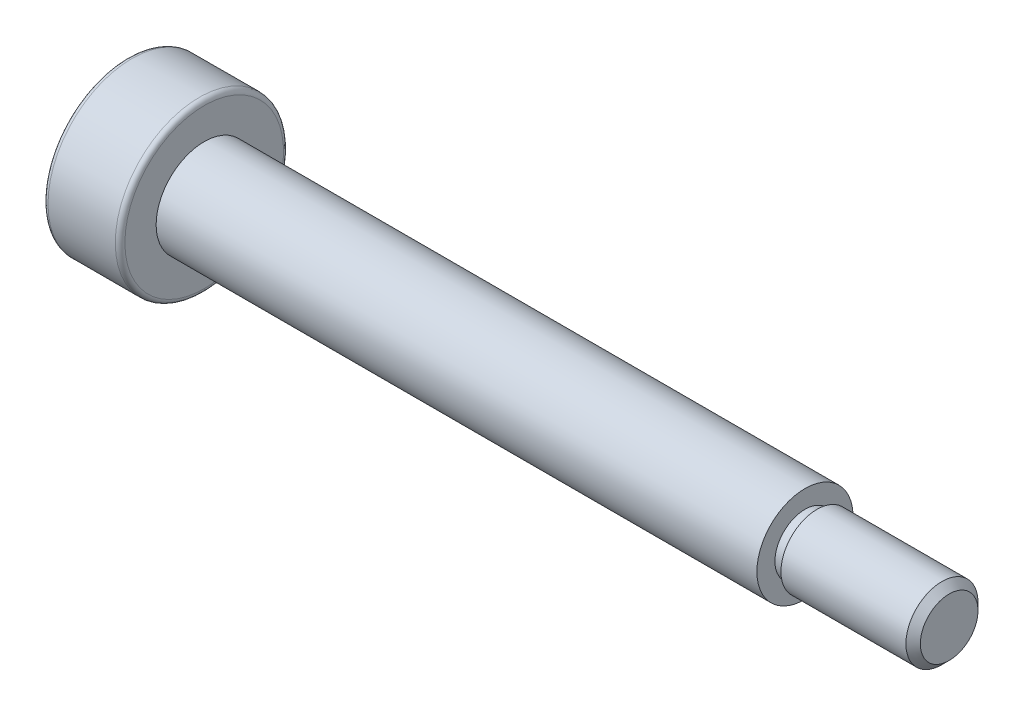
ISO-10303-21;
HEADER;
FILE_DESCRIPTION(('STEP AP214'),'2;1');
FILE_NAME('part.step','',(''),(''),'','','');
FILE_SCHEMA(('AUTOMOTIVE_DESIGN { 1 0 10303 214 1 1 1 1 }'));
ENDSEC;
DATA;
#1=APPLICATION_CONTEXT('core data for automotive mechanical design processes');
#2=APPLICATION_PROTOCOL_DEFINITION('international standard','automotive_design',2000,#1);
#3=PRODUCT_CONTEXT('',#1,'mechanical');
#4=PRODUCT('Part','Part','',(#3));
#5=PRODUCT_RELATED_PRODUCT_CATEGORY('part','',(#4));
#6=PRODUCT_DEFINITION_FORMATION('','',#4);
#7=PRODUCT_DEFINITION_CONTEXT('part definition',#1,'design');
#8=PRODUCT_DEFINITION('design','',#6,#7);
#9=PRODUCT_DEFINITION_SHAPE('','',#8);
#10=(LENGTH_UNIT() NAMED_UNIT(*) SI_UNIT(.MILLI.,.METRE.));
#11=(NAMED_UNIT(*) PLANE_ANGLE_UNIT() SI_UNIT($,.RADIAN.));
#12=(NAMED_UNIT(*) SI_UNIT($,.STERADIAN.) SOLID_ANGLE_UNIT());
#13=UNCERTAINTY_MEASURE_WITH_UNIT(LENGTH_MEASURE(1.E-05),#10,'distance_accuracy_value','');
#14=(GEOMETRIC_REPRESENTATION_CONTEXT(3) GLOBAL_UNCERTAINTY_ASSIGNED_CONTEXT((#13)) GLOBAL_UNIT_ASSIGNED_CONTEXT((#10,
#11,#12)) REPRESENTATION_CONTEXT('',''));
#15=CARTESIAN_POINT('',(0.,0.,0.));
#16=DIRECTION('',(0.,0.,1.));
#17=DIRECTION('',(1.,0.,0.));
#18=AXIS2_PLACEMENT_3D('',#15,#16,#17);
#19=CARTESIAN_POINT('',(-17.1,0.,0.));
#20=DIRECTION('',(1.,0.,0.));
#21=DIRECTION('',(0.,0.,-1.));
#22=AXIS2_PLACEMENT_3D('',#19,#20,#21);
#23=PLANE('',#22);
#24=DIRECTION('',(0.,0.866025403784438,-0.5));
#25=VECTOR('',#24,1.);
#26=CARTESIAN_POINT('',(-17.1,0.,1.73205080756888));
#27=LINE('',#26,#25);
#28=CARTESIAN_POINT('',(-17.1,0.,1.73205080756888));
#29=VERTEX_POINT('',#28);
#30=CARTESIAN_POINT('',(-17.1,1.5,0.866025403784438));
#31=VERTEX_POINT('',#30);
#32=EDGE_CURVE('E127',#29,#31,#27,.T.);
#33=ORIENTED_EDGE('',*,*,#32,.F.);
#34=DIRECTION('',(0.,0.866025403784439,0.5));
#35=VECTOR('',#34,1.);
#36=CARTESIAN_POINT('',(-17.1,-1.5,0.866025403784438));
#37=LINE('',#36,#35);
#38=CARTESIAN_POINT('',(-17.1,-1.5,0.866025403784438));
#39=VERTEX_POINT('',#38);
#40=EDGE_CURVE('E53',#39,#29,#37,.T.);
#41=ORIENTED_EDGE('',*,*,#40,.F.);
#42=DIRECTION('',(0.,0.,1.));
#43=VECTOR('',#42,1.);
#44=CARTESIAN_POINT('',(-17.1,-1.5,-0.866025403784438));
#45=LINE('',#44,#43);
#46=CARTESIAN_POINT('',(-17.1,-1.5,-0.866025403784438));
#47=VERTEX_POINT('',#46);
#48=EDGE_CURVE('E136',#47,#39,#45,.T.);
#49=ORIENTED_EDGE('',*,*,#48,.F.);
#50=DIRECTION('',(0.,-0.866025403784438,0.5));
#51=VECTOR('',#50,1.);
#52=CARTESIAN_POINT('',(-17.1,0.,-1.73205080756888));
#53=LINE('',#52,#51);
#54=CARTESIAN_POINT('',(-17.1,0.,-1.73205080756888));
#55=VERTEX_POINT('',#54);
#56=EDGE_CURVE('E134',#55,#47,#53,.T.);
#57=ORIENTED_EDGE('',*,*,#56,.F.);
#58=DIRECTION('',(0.,-0.866025403784439,-0.5));
#59=VECTOR('',#58,1.);
#60=CARTESIAN_POINT('',(-17.1,1.5,-0.866025403784438));
#61=LINE('',#60,#59);
#62=CARTESIAN_POINT('',(-17.1,1.5,-0.866025403784438));
#63=VERTEX_POINT('',#62);
#64=EDGE_CURVE('E101',#63,#55,#61,.T.);
#65=ORIENTED_EDGE('',*,*,#64,.F.);
#66=DIRECTION('',(0.,0.,-1.));
#67=VECTOR('',#66,1.);
#68=CARTESIAN_POINT('',(-17.1,1.5,0.866025403784438));
#69=LINE('',#68,#67);
#70=EDGE_CURVE('E130',#31,#63,#69,.T.);
#71=ORIENTED_EDGE('',*,*,#70,.F.);
#72=EDGE_LOOP('',(#33,#41,#49,#57,#65,#71));
#73=FACE_BOUND('',#72,.T.);
#74=CARTESIAN_POINT('',(-17.1,0.,0.));
#75=DIRECTION('',(1.,0.,0.));
#76=DIRECTION('',(0.,0.,-1.));
#77=AXIS2_PLACEMENT_3D('',#74,#75,#76);
#78=CIRCLE('',#77,3.3);
#79=CARTESIAN_POINT('',(-17.1,0.,-3.3));
#80=VERTEX_POINT('',#79);
#81=EDGE_CURVE('E169',#80,#80,#78,.F.);
#82=ORIENTED_EDGE('',*,*,#81,.T.);
#83=EDGE_LOOP('',(#82));
#84=FACE_BOUND('',#83,.T.);
#85=ADVANCED_FACE('F37',(#73,#84),#23,.F.);
#86=CARTESIAN_POINT('',(-17.1,0.,0.));
#87=DIRECTION('',(-1.,0.,0.));
#88=DIRECTION('',(0.,0.,1.));
#89=AXIS2_PLACEMENT_3D('',#86,#87,#88);
#90=CYLINDRICAL_SURFACE('',#89,3.5);
#91=CARTESIAN_POINT('',(-14.1,0.,0.));
#92=DIRECTION('',(-1.,0.,0.));
#93=DIRECTION('',(0.,0.,1.));
#94=AXIS2_PLACEMENT_3D('',#91,#92,#93);
#95=CIRCLE('',#94,3.5);
#96=CARTESIAN_POINT('',(-14.1,0.,3.5));
#97=VERTEX_POINT('',#96);
#98=EDGE_CURVE('E163',#97,#97,#95,.T.);
#99=ORIENTED_EDGE('',*,*,#98,.T.);
#100=EDGE_LOOP('',(#99));
#101=FACE_BOUND('',#100,.T.);
#102=CARTESIAN_POINT('',(-16.9,0.,0.));
#103=DIRECTION('',(1.,0.,0.));
#104=DIRECTION('',(0.,0.,-1.));
#105=AXIS2_PLACEMENT_3D('',#102,#103,#104);
#106=CIRCLE('',#105,3.5);
#107=CARTESIAN_POINT('',(-16.9,0.,-3.5));
#108=VERTEX_POINT('',#107);
#109=EDGE_CURVE('E160',#108,#108,#106,.T.);
#110=ORIENTED_EDGE('',*,*,#109,.T.);
#111=EDGE_LOOP('',(#110));
#112=FACE_BOUND('',#111,.T.);
#113=ADVANCED_FACE('F191',(#101,#112),#90,.T.);
#114=CARTESIAN_POINT('',(-13.9,3.5,0.));
#115=DIRECTION('',(-1.,0.,0.));
#116=DIRECTION('',(0.,0.,1.));
#117=AXIS2_PLACEMENT_3D('',#114,#115,#116);
#118=PLANE('',#117);
#119=CARTESIAN_POINT('',(-13.9,0.,0.));
#120=DIRECTION('',(-1.,0.,0.));
#121=DIRECTION('',(0.,0.,1.));
#122=AXIS2_PLACEMENT_3D('',#119,#120,#121);
#123=CIRCLE('',#122,3.3);
#124=CARTESIAN_POINT('',(-13.9,0.,3.3));
#125=VERTEX_POINT('',#124);
#126=EDGE_CURVE('E166',#125,#125,#123,.F.);
#127=ORIENTED_EDGE('',*,*,#126,.T.);
#128=EDGE_LOOP('',(#127));
#129=FACE_BOUND('',#128,.T.);
#130=CARTESIAN_POINT('',(-13.9,0.,0.));
#131=DIRECTION('',(-1.,0.,0.));
#132=DIRECTION('',(0.,0.,1.));
#133=AXIS2_PLACEMENT_3D('',#130,#131,#132);
#134=CIRCLE('',#133,2.);
#135=CARTESIAN_POINT('',(-13.9,0.,2.));
#136=VERTEX_POINT('',#135);
#137=EDGE_CURVE('E157',#136,#136,#134,.T.);
#138=ORIENTED_EDGE('',*,*,#137,.T.);
#139=EDGE_LOOP('',(#138));
#140=FACE_BOUND('',#139,.T.);
#141=ADVANCED_FACE('F197',(#129,#140),#118,.F.);
#142=CARTESIAN_POINT('',(-17.1,0.,0.));
#143=DIRECTION('',(-1.,0.,0.));
#144=DIRECTION('',(0.,0.,1.));
#145=AXIS2_PLACEMENT_3D('',#142,#143,#144);
#146=CYLINDRICAL_SURFACE('',#145,2.);
#147=ORIENTED_EDGE('',*,*,#137,.F.);
#148=EDGE_LOOP('',(#147));
#149=FACE_BOUND('',#148,.T.);
#150=CARTESIAN_POINT('',(11.1,0.,0.));
#151=DIRECTION('',(-1.,0.,0.));
#152=DIRECTION('',(0.,0.,1.));
#153=AXIS2_PLACEMENT_3D('',#150,#151,#152);
#154=CIRCLE('',#153,2.);
#155=CARTESIAN_POINT('',(11.1,0.,2.));
#156=VERTEX_POINT('',#155);
#157=EDGE_CURVE('E154',#156,#156,#154,.T.);
#158=ORIENTED_EDGE('',*,*,#157,.T.);
#159=EDGE_LOOP('',(#158));
#160=FACE_BOUND('',#159,.T.);
#161=ADVANCED_FACE('F231',(#149,#160),#146,.T.);
#162=CARTESIAN_POINT('',(11.1,2.,0.));
#163=DIRECTION('',(-1.,0.,0.));
#164=DIRECTION('',(0.,0.,1.));
#165=AXIS2_PLACEMENT_3D('',#162,#163,#164);
#166=PLANE('',#165);
#167=ORIENTED_EDGE('',*,*,#157,.F.);
#168=EDGE_LOOP('',(#167));
#169=FACE_BOUND('',#168,.T.);
#170=CARTESIAN_POINT('',(11.1,0.,0.));
#171=DIRECTION('',(-1.,0.,0.));
#172=DIRECTION('',(0.,0.,1.));
#173=AXIS2_PLACEMENT_3D('',#170,#171,#172);
#174=CIRCLE('',#173,1.25);
#175=CARTESIAN_POINT('',(11.1,0.,1.25));
#176=VERTEX_POINT('',#175);
#177=EDGE_CURVE('E151',#176,#176,#174,.T.);
#178=ORIENTED_EDGE('',*,*,#177,.T.);
#179=EDGE_LOOP('',(#178));
#180=FACE_BOUND('',#179,.T.);
#181=ADVANCED_FACE('F207',(#169,#180),#166,.F.);
#182=CARTESIAN_POINT('',(-14.1,0.,0.));
#183=DIRECTION('',(-1.,0.,0.));
#184=DIRECTION('',(0.,0.,1.));
#185=AXIS2_PLACEMENT_3D('',#182,#183,#184);
#186=TOROIDAL_SURFACE('',#185,3.3,0.2);
#187=ORIENTED_EDGE('',*,*,#126,.F.);
#188=EDGE_LOOP('',(#187));
#189=FACE_BOUND('',#188,.T.);
#190=ORIENTED_EDGE('',*,*,#98,.F.);
#191=EDGE_LOOP('',(#190));
#192=FACE_BOUND('',#191,.T.);
#193=ADVANCED_FACE('F204',(#189,#192),#186,.T.);
#194=CARTESIAN_POINT('',(-16.9,0.,0.));
#195=DIRECTION('',(1.,0.,0.));
#196=DIRECTION('',(0.,0.,-1.));
#197=AXIS2_PLACEMENT_3D('',#194,#195,#196);
#198=TOROIDAL_SURFACE('',#197,3.3,0.2);
#199=ORIENTED_EDGE('',*,*,#109,.F.);
#200=EDGE_LOOP('',(#199));
#201=FACE_BOUND('',#200,.T.);
#202=ORIENTED_EDGE('',*,*,#81,.F.);
#203=EDGE_LOOP('',(#202));
#204=FACE_BOUND('',#203,.T.);
#205=ADVANCED_FACE('F206',(#201,#204),#198,.T.);
#206=CARTESIAN_POINT('',(11.1,0.,0.));
#207=DIRECTION('',(-1.,0.,0.));
#208=DIRECTION('',(0.,0.,1.));
#209=AXIS2_PLACEMENT_3D('',#206,#207,#208);
#210=CYLINDRICAL_SURFACE('',#209,1.25);
#211=CARTESIAN_POINT('',(11.6,0.,0.));
#212=DIRECTION('',(-1.,0.,0.));
#213=DIRECTION('',(0.,0.,1.));
#214=AXIS2_PLACEMENT_3D('',#211,#212,#213);
#215=CIRCLE('',#214,1.25);
#216=CARTESIAN_POINT('',(11.6,0.,1.25));
#217=VERTEX_POINT('',#216);
#218=EDGE_CURVE('E148',#217,#217,#215,.T.);
#219=ORIENTED_EDGE('',*,*,#218,.T.);
#220=EDGE_LOOP('',(#219));
#221=FACE_BOUND('',#220,.T.);
#222=ORIENTED_EDGE('',*,*,#177,.F.);
#223=EDGE_LOOP('',(#222));
#224=FACE_BOUND('',#223,.T.);
#225=ADVANCED_FACE('F210',(#221,#224),#210,.T.);
#226=CARTESIAN_POINT('',(11.6,1.5,0.));
#227=DIRECTION('',(-1.,0.,0.));
#228=DIRECTION('',(0.,0.,1.));
#229=AXIS2_PLACEMENT_3D('',#226,#227,#228);
#230=PLANE('',#229);
#231=CARTESIAN_POINT('',(11.6,0.,0.));
#232=DIRECTION('',(-1.,0.,0.));
#233=DIRECTION('',(0.,0.,1.));
#234=AXIS2_PLACEMENT_3D('',#231,#232,#233);
#235=CIRCLE('',#234,1.5);
#236=CARTESIAN_POINT('',(11.6,0.,1.5));
#237=VERTEX_POINT('',#236);
#238=EDGE_CURVE('E140',#237,#237,#235,.T.);
#239=ORIENTED_EDGE('',*,*,#238,.T.);
#240=EDGE_LOOP('',(#239));
#241=FACE_BOUND('',#240,.T.);
#242=ORIENTED_EDGE('',*,*,#218,.F.);
#243=EDGE_LOOP('',(#242));
#244=FACE_BOUND('',#243,.T.);
#245=ADVANCED_FACE('F186',(#241,#244),#230,.T.);
#246=CARTESIAN_POINT('',(17.1,1.5,0.));
#247=DIRECTION('',(-1.,0.,0.));
#248=DIRECTION('',(0.,0.,1.));
#249=AXIS2_PLACEMENT_3D('',#246,#247,#248);
#250=PLANE('',#249);
#251=CARTESIAN_POINT('',(17.1,0.,0.));
#252=DIRECTION('',(-1.,0.,0.));
#253=DIRECTION('',(0.,0.,1.));
#254=AXIS2_PLACEMENT_3D('',#251,#252,#253);
#255=CIRCLE('',#254,1.2);
#256=CARTESIAN_POINT('',(17.1,0.,1.2));
#257=VERTEX_POINT('',#256);
#258=EDGE_CURVE('E11',#257,#257,#255,.F.);
#259=ORIENTED_EDGE('',*,*,#258,.T.);
#260=EDGE_LOOP('',(#259));
#261=FACE_BOUND('',#260,.T.);
#262=ADVANCED_FACE('F178',(#261),#250,.F.);
#263=CARTESIAN_POINT('',(16.8,0.,0.));
#264=DIRECTION('',(-1.,0.,0.));
#265=DIRECTION('',(0.,0.,1.));
#266=AXIS2_PLACEMENT_3D('',#263,#264,#265);
#267=CONICAL_SURFACE('',#266,1.5,0.785398163397447);
#268=ORIENTED_EDGE('',*,*,#258,.F.);
#269=EDGE_LOOP('',(#268));
#270=FACE_BOUND('',#269,.T.);
#271=CARTESIAN_POINT('',(16.8,0.,0.));
#272=DIRECTION('',(-1.,0.,0.));
#273=DIRECTION('',(0.,0.,1.));
#274=AXIS2_PLACEMENT_3D('',#271,#272,#273);
#275=CIRCLE('',#274,1.5);
#276=CARTESIAN_POINT('',(16.8,0.,1.5));
#277=VERTEX_POINT('',#276);
#278=EDGE_CURVE('E46',#277,#277,#275,.T.);
#279=ORIENTED_EDGE('',*,*,#278,.F.);
#280=EDGE_LOOP('',(#279));
#281=FACE_BOUND('',#280,.T.);
#282=ADVANCED_FACE('F40',(#270,#281),#267,.T.);
#283=CARTESIAN_POINT('',(-17.1,0.,0.));
#284=DIRECTION('',(-1.,0.,0.));
#285=DIRECTION('',(0.,0.,1.));
#286=AXIS2_PLACEMENT_3D('',#283,#284,#285);
#287=CYLINDRICAL_SURFACE('',#286,1.5);
#288=ORIENTED_EDGE('',*,*,#278,.T.);
#289=EDGE_LOOP('',(#288));
#290=FACE_BOUND('',#289,.T.);
#291=ORIENTED_EDGE('',*,*,#238,.F.);
#292=EDGE_LOOP('',(#291));
#293=FACE_BOUND('',#292,.T.);
#294=ADVANCED_FACE('F174',(#290,#293),#287,.T.);
#295=CARTESIAN_POINT('',(-15.1,-1.5,0.866025403784438));
#296=DIRECTION('',(0.,-0.5,0.866025403784439));
#297=DIRECTION('',(0.,-0.866025403784439,-0.5));
#298=AXIS2_PLACEMENT_3D('',#295,#296,#297);
#299=PLANE('',#298);
#300=ORIENTED_EDGE('',*,*,#40,.T.);
#301=DIRECTION('',(-1.,0.,0.));
#302=VECTOR('',#301,1.);
#303=CARTESIAN_POINT('',(-15.1,0.,1.73205080756888));
#304=LINE('',#303,#302);
#305=CARTESIAN_POINT('',(-15.1,0.,1.73205080756888));
#306=VERTEX_POINT('',#305);
#307=EDGE_CURVE('E83',#306,#29,#304,.T.);
#308=ORIENTED_EDGE('',*,*,#307,.F.);
#309=DIRECTION('',(0.,0.866025403784439,0.5));
#310=VECTOR('',#309,1.);
#311=CARTESIAN_POINT('',(-15.1,-1.5,0.866025403784438));
#312=LINE('',#311,#310);
#313=CARTESIAN_POINT('',(-15.1,-1.5,0.866025403784438));
#314=VERTEX_POINT('',#313);
#315=EDGE_CURVE('E138',#314,#306,#312,.T.);
#316=ORIENTED_EDGE('',*,*,#315,.F.);
#317=DIRECTION('',(-1.,0.,0.));
#318=VECTOR('',#317,1.);
#319=CARTESIAN_POINT('',(-15.1,-1.5,0.866025403784438));
#320=LINE('',#319,#318);
#321=EDGE_CURVE('E61',#314,#39,#320,.T.);
#322=ORIENTED_EDGE('',*,*,#321,.T.);
#323=EDGE_LOOP('',(#300,#308,#316,#322));
#324=FACE_BOUND('',#323,.T.);
#325=ADVANCED_FACE('F184',(#324),#299,.F.);
#326=CARTESIAN_POINT('',(-15.1,-1.5,-0.866025403784438));
#327=DIRECTION('',(0.,-1.,0.));
#328=DIRECTION('',(0.,0.,-1.));
#329=AXIS2_PLACEMENT_3D('',#326,#327,#328);
#330=PLANE('',#329);
#331=ORIENTED_EDGE('',*,*,#48,.T.);
#332=ORIENTED_EDGE('',*,*,#321,.F.);
#333=DIRECTION('',(0.,0.,1.));
#334=VECTOR('',#333,1.);
#335=CARTESIAN_POINT('',(-15.1,-1.5,-0.866025403784438));
#336=LINE('',#335,#334);
#337=CARTESIAN_POINT('',(-15.1,-1.5,-0.866025403784438));
#338=VERTEX_POINT('',#337);
#339=EDGE_CURVE('E113',#338,#314,#336,.T.);
#340=ORIENTED_EDGE('',*,*,#339,.F.);
#341=DIRECTION('',(-1.,0.,0.));
#342=VECTOR('',#341,1.);
#343=CARTESIAN_POINT('',(-15.1,-1.5,-0.866025403784438));
#344=LINE('',#343,#342);
#345=EDGE_CURVE('E105',#338,#47,#344,.T.);
#346=ORIENTED_EDGE('',*,*,#345,.T.);
#347=EDGE_LOOP('',(#331,#332,#340,#346));
#348=FACE_BOUND('',#347,.T.);
#349=ADVANCED_FACE('F305',(#348),#330,.F.);
#350=CARTESIAN_POINT('',(-15.1,0.,-1.73205080756888));
#351=DIRECTION('',(0.,-0.5,-0.866025403784438));
#352=DIRECTION('',(0.,0.866025403784439,-0.5));
#353=AXIS2_PLACEMENT_3D('',#350,#351,#352);
#354=PLANE('',#353);
#355=ORIENTED_EDGE('',*,*,#56,.T.);
#356=ORIENTED_EDGE('',*,*,#345,.F.);
#357=DIRECTION('',(0.,-0.866025403784438,0.5));
#358=VECTOR('',#357,1.);
#359=CARTESIAN_POINT('',(-15.1,0.,-1.73205080756888));
#360=LINE('',#359,#358);
#361=CARTESIAN_POINT('',(-15.1,0.,-1.73205080756888));
#362=VERTEX_POINT('',#361);
#363=EDGE_CURVE('E109',#362,#338,#360,.T.);
#364=ORIENTED_EDGE('',*,*,#363,.F.);
#365=DIRECTION('',(-1.,0.,0.));
#366=VECTOR('',#365,1.);
#367=CARTESIAN_POINT('',(-15.1,0.,-1.73205080756888));
#368=LINE('',#367,#366);
#369=EDGE_CURVE('E94',#362,#55,#368,.T.);
#370=ORIENTED_EDGE('',*,*,#369,.T.);
#371=EDGE_LOOP('',(#355,#356,#364,#370));
#372=FACE_BOUND('',#371,.T.);
#373=ADVANCED_FACE('F110',(#372),#354,.F.);
#374=CARTESIAN_POINT('',(-15.1,1.5,-0.866025403784438));
#375=DIRECTION('',(0.,0.5,-0.866025403784439));
#376=DIRECTION('',(0.,0.866025403784439,0.5));
#377=AXIS2_PLACEMENT_3D('',#374,#375,#376);
#378=PLANE('',#377);
#379=ORIENTED_EDGE('',*,*,#64,.T.);
#380=ORIENTED_EDGE('',*,*,#369,.F.);
#381=DIRECTION('',(0.,-0.866025403784439,-0.5));
#382=VECTOR('',#381,1.);
#383=CARTESIAN_POINT('',(-15.1,1.5,-0.866025403784438));
#384=LINE('',#383,#382);
#385=CARTESIAN_POINT('',(-15.1,1.5,-0.866025403784438));
#386=VERTEX_POINT('',#385);
#387=EDGE_CURVE('E98',#386,#362,#384,.T.);
#388=ORIENTED_EDGE('',*,*,#387,.F.);
#389=DIRECTION('',(-1.,0.,0.));
#390=VECTOR('',#389,1.);
#391=CARTESIAN_POINT('',(-15.1,1.5,-0.866025403784438));
#392=LINE('',#391,#390);
#393=EDGE_CURVE('E106',#386,#63,#392,.T.);
#394=ORIENTED_EDGE('',*,*,#393,.T.);
#395=EDGE_LOOP('',(#379,#380,#388,#394));
#396=FACE_BOUND('',#395,.T.);
#397=ADVANCED_FACE('F96',(#396),#378,.F.);
#398=CARTESIAN_POINT('',(-15.1,1.5,0.866025403784438));
#399=DIRECTION('',(0.,1.,0.));
#400=DIRECTION('',(0.,0.,1.));
#401=AXIS2_PLACEMENT_3D('',#398,#399,#400);
#402=PLANE('',#401);
#403=ORIENTED_EDGE('',*,*,#70,.T.);
#404=ORIENTED_EDGE('',*,*,#393,.F.);
#405=DIRECTION('',(0.,0.,-1.));
#406=VECTOR('',#405,1.);
#407=CARTESIAN_POINT('',(-15.1,1.5,0.866025403784438));
#408=LINE('',#407,#406);
#409=CARTESIAN_POINT('',(-15.1,1.5,0.866025403784438));
#410=VERTEX_POINT('',#409);
#411=EDGE_CURVE('E119',#410,#386,#408,.T.);
#412=ORIENTED_EDGE('',*,*,#411,.F.);
#413=DIRECTION('',(-1.,0.,0.));
#414=VECTOR('',#413,1.);
#415=CARTESIAN_POINT('',(-15.1,1.5,0.866025403784438));
#416=LINE('',#415,#414);
#417=EDGE_CURVE('E143',#410,#31,#416,.T.);
#418=ORIENTED_EDGE('',*,*,#417,.T.);
#419=EDGE_LOOP('',(#403,#404,#412,#418));
#420=FACE_BOUND('',#419,.T.);
#421=ADVANCED_FACE('F326',(#420),#402,.F.);
#422=CARTESIAN_POINT('',(-15.1,0.,1.73205080756888));
#423=DIRECTION('',(0.,0.5,0.866025403784438));
#424=DIRECTION('',(0.,-0.866025403784439,0.5));
#425=AXIS2_PLACEMENT_3D('',#422,#423,#424);
#426=PLANE('',#425);
#427=ORIENTED_EDGE('',*,*,#32,.T.);
#428=ORIENTED_EDGE('',*,*,#417,.F.);
#429=DIRECTION('',(0.,0.866025403784438,-0.5));
#430=VECTOR('',#429,1.);
#431=CARTESIAN_POINT('',(-15.1,0.,1.73205080756888));
#432=LINE('',#431,#430);
#433=EDGE_CURVE('E121',#306,#410,#432,.T.);
#434=ORIENTED_EDGE('',*,*,#433,.F.);
#435=ORIENTED_EDGE('',*,*,#307,.T.);
#436=EDGE_LOOP('',(#427,#428,#434,#435));
#437=FACE_BOUND('',#436,.T.);
#438=ADVANCED_FACE('F334',(#437),#426,.F.);
#439=CARTESIAN_POINT('',(-15.1,0.,0.));
#440=DIRECTION('',(-1.,0.,0.));
#441=DIRECTION('',(0.,0.,1.));
#442=AXIS2_PLACEMENT_3D('',#439,#440,#441);
#443=PLANE('',#442);
#444=ORIENTED_EDGE('',*,*,#315,.T.);
#445=ORIENTED_EDGE('',*,*,#433,.T.);
#446=ORIENTED_EDGE('',*,*,#411,.T.);
#447=ORIENTED_EDGE('',*,*,#387,.T.);
#448=ORIENTED_EDGE('',*,*,#363,.T.);
#449=ORIENTED_EDGE('',*,*,#339,.T.);
#450=EDGE_LOOP('',(#444,#445,#446,#447,#448,#449));
#451=FACE_BOUND('',#450,.T.);
#452=ADVANCED_FACE('F116',(#451),#443,.T.);
#453=CLOSED_SHELL('',(#85,#113,#141,#161,#181,#193,#205,#225,#245,#262,#282,#294,#325,#349,#373,
#397,#421,#438,#452));
#454=MANIFOLD_SOLID_BREP('B2',#453);
#455=ADVANCED_BREP_SHAPE_REPRESENTATION('',(#18,#454),#14);
#456=SHAPE_DEFINITION_REPRESENTATION(#9,#455);
ENDSEC;
END-ISO-10303-21;
